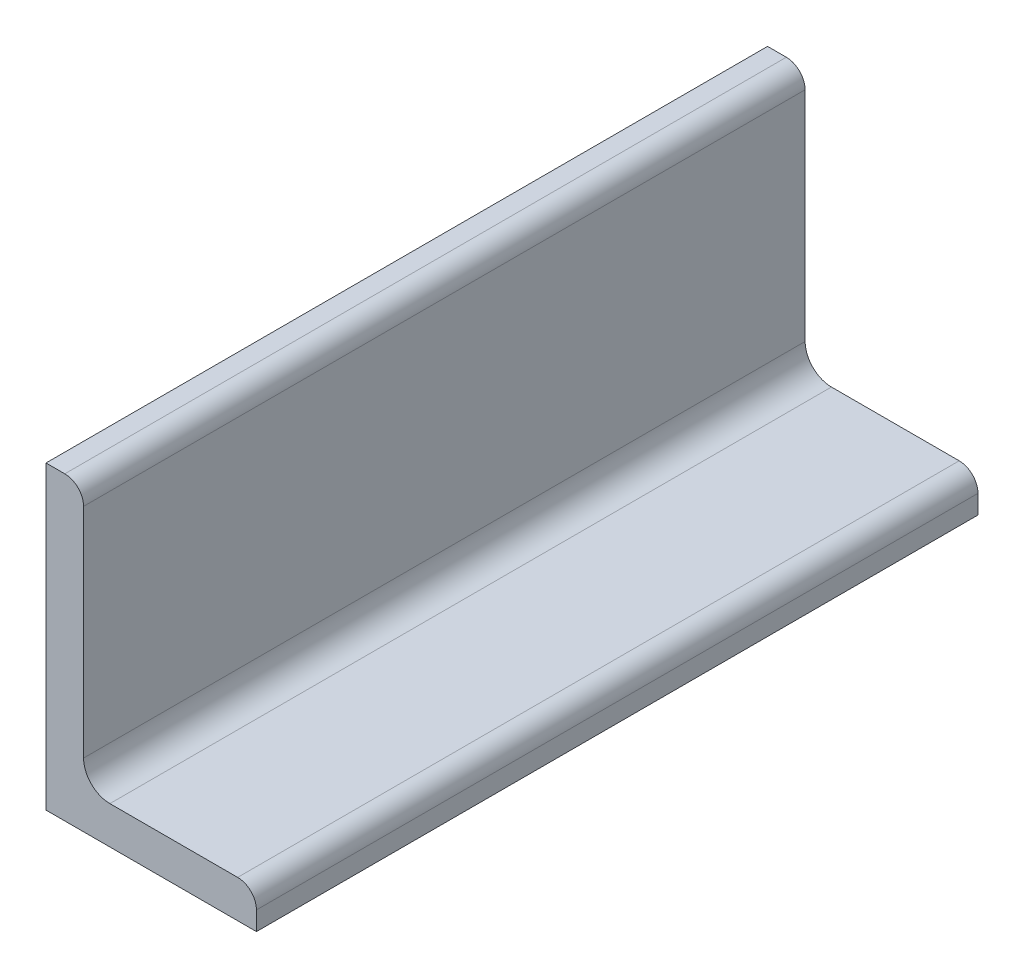
ISO-10303-21;
HEADER;
FILE_DESCRIPTION(('STEP AP214'),'2;1');
FILE_NAME('part.step','',(''),(''),'','','');
FILE_SCHEMA(('AUTOMOTIVE_DESIGN { 1 0 10303 214 1 1 1 1 }'));
ENDSEC;
DATA;
#1=APPLICATION_CONTEXT('core data for automotive mechanical design processes');
#2=APPLICATION_PROTOCOL_DEFINITION('international standard','automotive_design',2000,#1);
#3=PRODUCT_CONTEXT('',#1,'mechanical');
#4=PRODUCT('Part','Part','',(#3));
#5=PRODUCT_RELATED_PRODUCT_CATEGORY('part','',(#4));
#6=PRODUCT_DEFINITION_FORMATION('','',#4);
#7=PRODUCT_DEFINITION_CONTEXT('part definition',#1,'design');
#8=PRODUCT_DEFINITION('design','',#6,#7);
#9=PRODUCT_DEFINITION_SHAPE('','',#8);
#10=(LENGTH_UNIT() NAMED_UNIT(*) SI_UNIT(.MILLI.,.METRE.));
#11=(NAMED_UNIT(*) PLANE_ANGLE_UNIT() SI_UNIT($,.RADIAN.));
#12=(NAMED_UNIT(*) SI_UNIT($,.STERADIAN.) SOLID_ANGLE_UNIT());
#13=UNCERTAINTY_MEASURE_WITH_UNIT(LENGTH_MEASURE(1.E-05),#10,'distance_accuracy_value','');
#14=(GEOMETRIC_REPRESENTATION_CONTEXT(3) GLOBAL_UNCERTAINTY_ASSIGNED_CONTEXT((#13)) GLOBAL_UNIT_ASSIGNED_CONTEXT((#10,
#11,#12)) REPRESENTATION_CONTEXT('',''));
#15=CARTESIAN_POINT('',(0.,0.,0.));
#16=DIRECTION('',(0.,0.,1.));
#17=DIRECTION('',(1.,0.,0.));
#18=AXIS2_PLACEMENT_3D('',#15,#16,#17);
#19=CARTESIAN_POINT('',(0.0836264027816469,127.041655270204,304.8));
#20=DIRECTION('',(1.,0.,0.));
#21=DIRECTION('',(0.,0.,-1.));
#22=AXIS2_PLACEMENT_3D('',#19,#20,#21);
#23=PLANE('',#22);
#24=DIRECTION('',(0.,-1.,0.));
#25=VECTOR('',#24,1.);
#26=CARTESIAN_POINT('',(0.0836264027816469,127.041655270204,0.));
#27=LINE('',#26,#25);
#28=CARTESIAN_POINT('',(0.0836264027816469,127.041655270204,0.));
#29=VERTEX_POINT('',#28);
#30=CARTESIAN_POINT('',(0.0836264027816469,0.0416552702040917,0.));
#31=VERTEX_POINT('',#30);
#32=EDGE_CURVE('E135',#29,#31,#27,.T.);
#33=ORIENTED_EDGE('',*,*,#32,.T.);
#34=DIRECTION('',(0.,0.,-1.));
#35=VECTOR('',#34,1.);
#36=CARTESIAN_POINT('',(0.0836264027816469,0.0416552702040917,304.8));
#37=LINE('',#36,#35);
#38=CARTESIAN_POINT('',(0.0836264027816469,0.0416552702040917,304.8));
#39=VERTEX_POINT('',#38);
#40=EDGE_CURVE('E11',#39,#31,#37,.T.);
#41=ORIENTED_EDGE('',*,*,#40,.F.);
#42=DIRECTION('',(0.,-1.,0.));
#43=VECTOR('',#42,1.);
#44=CARTESIAN_POINT('',(0.0836264027816469,127.041655270204,304.8));
#45=LINE('',#44,#43);
#46=CARTESIAN_POINT('',(0.0836264027816469,127.041655270204,304.8));
#47=VERTEX_POINT('',#46);
#48=EDGE_CURVE('E151',#47,#39,#45,.T.);
#49=ORIENTED_EDGE('',*,*,#48,.F.);
#50=DIRECTION('',(0.,0.,-1.));
#51=VECTOR('',#50,1.);
#52=CARTESIAN_POINT('',(0.0836264027816469,127.041655270204,304.8));
#53=LINE('',#52,#51);
#54=EDGE_CURVE('E131',#47,#29,#53,.T.);
#55=ORIENTED_EDGE('',*,*,#54,.T.);
#56=EDGE_LOOP('',(#33,#41,#49,#55));
#57=FACE_BOUND('',#56,.T.);
#58=ADVANCED_FACE('F33',(#57),#23,.F.);
#59=CARTESIAN_POINT('',(0.0836264027816469,0.0416552702040917,304.8));
#60=DIRECTION('',(0.,1.,0.));
#61=DIRECTION('',(0.,0.,1.));
#62=AXIS2_PLACEMENT_3D('',#59,#60,#61);
#63=PLANE('',#62);
#64=DIRECTION('',(1.,0.,0.));
#65=VECTOR('',#64,1.);
#66=CARTESIAN_POINT('',(0.0836264027816469,0.0416552702040917,0.));
#67=LINE('',#66,#65);
#68=CARTESIAN_POINT('',(88.9836264027817,0.0416552702040917,0.));
#69=VERTEX_POINT('',#68);
#70=EDGE_CURVE('E138',#31,#69,#67,.T.);
#71=ORIENTED_EDGE('',*,*,#70,.T.);
#72=DIRECTION('',(0.,0.,-1.));
#73=VECTOR('',#72,1.);
#74=CARTESIAN_POINT('',(88.9836264027817,0.0416552702040917,304.8));
#75=LINE('',#74,#73);
#76=CARTESIAN_POINT('',(88.9836264027817,0.0416552702040917,304.8));
#77=VERTEX_POINT('',#76);
#78=EDGE_CURVE('E41',#77,#69,#75,.T.);
#79=ORIENTED_EDGE('',*,*,#78,.F.);
#80=DIRECTION('',(1.,0.,0.));
#81=VECTOR('',#80,1.);
#82=CARTESIAN_POINT('',(0.0836264027816469,0.0416552702040917,304.8));
#83=LINE('',#82,#81);
#84=EDGE_CURVE('E95',#39,#77,#83,.T.);
#85=ORIENTED_EDGE('',*,*,#84,.F.);
#86=ORIENTED_EDGE('',*,*,#40,.T.);
#87=EDGE_LOOP('',(#71,#79,#85,#86));
#88=FACE_BOUND('',#87,.T.);
#89=ADVANCED_FACE('F194',(#88),#63,.F.);
#90=CARTESIAN_POINT('',(88.9836264027817,0.0416552702040917,304.8));
#91=DIRECTION('',(-1.,0.,0.));
#92=DIRECTION('',(0.,0.,1.));
#93=AXIS2_PLACEMENT_3D('',#90,#91,#92);
#94=PLANE('',#93);
#95=DIRECTION('',(0.,1.,0.));
#96=VECTOR('',#95,1.);
#97=CARTESIAN_POINT('',(88.9836264027817,0.0416552702040917,0.));
#98=LINE('',#97,#96);
#99=CARTESIAN_POINT('',(88.9836264027817,7.97915527020409,0.));
#100=VERTEX_POINT('',#99);
#101=EDGE_CURVE('E140',#69,#100,#98,.T.);
#102=ORIENTED_EDGE('',*,*,#101,.T.);
#103=DIRECTION('',(0.,0.,-1.));
#104=VECTOR('',#103,1.);
#105=CARTESIAN_POINT('',(88.9836264027817,7.97915527020409,304.8));
#106=LINE('',#105,#104);
#107=CARTESIAN_POINT('',(88.9836264027817,7.97915527020409,304.8));
#108=VERTEX_POINT('',#107);
#109=EDGE_CURVE('E161',#108,#100,#106,.T.);
#110=ORIENTED_EDGE('',*,*,#109,.F.);
#111=DIRECTION('',(0.,1.,0.));
#112=VECTOR('',#111,1.);
#113=CARTESIAN_POINT('',(88.9836264027817,0.0416552702040917,304.8));
#114=LINE('',#113,#112);
#115=EDGE_CURVE('E169',#77,#108,#114,.T.);
#116=ORIENTED_EDGE('',*,*,#115,.F.);
#117=ORIENTED_EDGE('',*,*,#78,.T.);
#118=EDGE_LOOP('',(#102,#110,#116,#117));
#119=FACE_BOUND('',#118,.T.);
#120=ADVANCED_FACE('F167',(#119),#94,.F.);
#121=CARTESIAN_POINT('',(81.0461264027816,7.97915527020409,304.8));
#122=DIRECTION('',(0.,0.,-1.));
#123=DIRECTION('',(-1.,0.,0.));
#124=AXIS2_PLACEMENT_3D('',#121,#122,#123);
#125=CYLINDRICAL_SURFACE('',#124,7.93750000000001);
#126=CARTESIAN_POINT('',(81.0461264027816,7.97915527020409,0.));
#127=DIRECTION('',(0.,0.,1.));
#128=DIRECTION('',(1.,0.,0.));
#129=AXIS2_PLACEMENT_3D('',#126,#127,#128);
#130=CIRCLE('',#129,7.93750000000001);
#131=CARTESIAN_POINT('',(81.0461264027816,15.9166552702041,0.));
#132=VERTEX_POINT('',#131);
#133=EDGE_CURVE('E142',#100,#132,#130,.T.);
#134=ORIENTED_EDGE('',*,*,#133,.T.);
#135=DIRECTION('',(0.,0.,-1.));
#136=VECTOR('',#135,1.);
#137=CARTESIAN_POINT('',(81.0461264027816,15.9166552702041,304.8));
#138=LINE('',#137,#136);
#139=CARTESIAN_POINT('',(81.0461264027816,15.9166552702041,304.8));
#140=VERTEX_POINT('',#139);
#141=EDGE_CURVE('E158',#140,#132,#138,.T.);
#142=ORIENTED_EDGE('',*,*,#141,.F.);
#143=CARTESIAN_POINT('',(81.0461264027816,7.97915527020409,304.8));
#144=DIRECTION('',(0.,0.,1.));
#145=DIRECTION('',(1.,0.,0.));
#146=AXIS2_PLACEMENT_3D('',#143,#144,#145);
#147=CIRCLE('',#146,7.93750000000001);
#148=EDGE_CURVE('E185',#108,#140,#147,.T.);
#149=ORIENTED_EDGE('',*,*,#148,.F.);
#150=ORIENTED_EDGE('',*,*,#109,.T.);
#151=EDGE_LOOP('',(#134,#142,#149,#150));
#152=FACE_BOUND('',#151,.T.);
#153=ADVANCED_FACE('F178',(#152),#125,.T.);
#154=CARTESIAN_POINT('',(81.0461264027816,15.9166552702041,304.8));
#155=DIRECTION('',(0.,-1.,0.));
#156=DIRECTION('',(0.,0.,-1.));
#157=AXIS2_PLACEMENT_3D('',#154,#155,#156);
#158=PLANE('',#157);
#159=DIRECTION('',(-1.,0.,0.));
#160=VECTOR('',#159,1.);
#161=CARTESIAN_POINT('',(81.0461264027816,15.9166552702041,0.));
#162=LINE('',#161,#160);
#163=CARTESIAN_POINT('',(27.0711264027816,15.9166552702041,0.));
#164=VERTEX_POINT('',#163);
#165=EDGE_CURVE('E144',#132,#164,#162,.T.);
#166=ORIENTED_EDGE('',*,*,#165,.T.);
#167=DIRECTION('',(0.,0.,-1.));
#168=VECTOR('',#167,1.);
#169=CARTESIAN_POINT('',(27.0711264027816,15.9166552702041,304.8));
#170=LINE('',#169,#168);
#171=CARTESIAN_POINT('',(27.0711264027816,15.9166552702041,304.8));
#172=VERTEX_POINT('',#171);
#173=EDGE_CURVE('E155',#172,#164,#170,.T.);
#174=ORIENTED_EDGE('',*,*,#173,.F.);
#175=DIRECTION('',(-1.,0.,0.));
#176=VECTOR('',#175,1.);
#177=CARTESIAN_POINT('',(81.0461264027816,15.9166552702041,304.8));
#178=LINE('',#177,#176);
#179=EDGE_CURVE('E184',#140,#172,#178,.T.);
#180=ORIENTED_EDGE('',*,*,#179,.F.);
#181=ORIENTED_EDGE('',*,*,#141,.T.);
#182=EDGE_LOOP('',(#166,#174,#180,#181));
#183=FACE_BOUND('',#182,.T.);
#184=ADVANCED_FACE('F182',(#183),#158,.F.);
#185=CARTESIAN_POINT('',(27.0711264027816,27.0291552702041,304.8));
#186=DIRECTION('',(0.,0.,-1.));
#187=DIRECTION('',(-1.,0.,0.));
#188=AXIS2_PLACEMENT_3D('',#185,#186,#187);
#189=CYLINDRICAL_SURFACE('',#188,11.1125);
#190=CARTESIAN_POINT('',(27.0711264027816,27.0291552702041,0.));
#191=DIRECTION('',(0.,0.,-1.));
#192=DIRECTION('',(1.,0.,0.));
#193=AXIS2_PLACEMENT_3D('',#190,#191,#192);
#194=CIRCLE('',#193,11.1125);
#195=CARTESIAN_POINT('',(15.9586264027816,27.0291552702041,0.));
#196=VERTEX_POINT('',#195);
#197=EDGE_CURVE('E146',#164,#196,#194,.T.);
#198=ORIENTED_EDGE('',*,*,#197,.T.);
#199=DIRECTION('',(0.,0.,-1.));
#200=VECTOR('',#199,1.);
#201=CARTESIAN_POINT('',(15.9586264027816,27.0291552702041,304.8));
#202=LINE('',#201,#200);
#203=CARTESIAN_POINT('',(15.9586264027816,27.0291552702041,304.8));
#204=VERTEX_POINT('',#203);
#205=EDGE_CURVE('E126',#204,#196,#202,.T.);
#206=ORIENTED_EDGE('',*,*,#205,.F.);
#207=CARTESIAN_POINT('',(27.0711264027816,27.0291552702041,304.8));
#208=DIRECTION('',(0.,0.,-1.));
#209=DIRECTION('',(1.,0.,0.));
#210=AXIS2_PLACEMENT_3D('',#207,#208,#209);
#211=CIRCLE('',#210,11.1125);
#212=EDGE_CURVE('E117',#172,#204,#211,.T.);
#213=ORIENTED_EDGE('',*,*,#212,.F.);
#214=ORIENTED_EDGE('',*,*,#173,.T.);
#215=EDGE_LOOP('',(#198,#206,#213,#214));
#216=FACE_BOUND('',#215,.T.);
#217=ADVANCED_FACE('F206',(#216),#189,.F.);
#218=CARTESIAN_POINT('',(15.9586264027816,27.0291552702041,304.8));
#219=DIRECTION('',(-1.,0.,0.));
#220=DIRECTION('',(0.,0.,1.));
#221=AXIS2_PLACEMENT_3D('',#218,#219,#220);
#222=PLANE('',#221);
#223=DIRECTION('',(0.,1.,0.));
#224=VECTOR('',#223,1.);
#225=CARTESIAN_POINT('',(15.9586264027816,27.0291552702041,0.));
#226=LINE('',#225,#224);
#227=CARTESIAN_POINT('',(15.9586264027816,119.104155270204,0.));
#228=VERTEX_POINT('',#227);
#229=EDGE_CURVE('E125',#196,#228,#226,.T.);
#230=ORIENTED_EDGE('',*,*,#229,.T.);
#231=DIRECTION('',(0.,0.,-1.));
#232=VECTOR('',#231,1.);
#233=CARTESIAN_POINT('',(15.9586264027816,119.104155270204,304.8));
#234=LINE('',#233,#232);
#235=CARTESIAN_POINT('',(15.9586264027816,119.104155270204,304.8));
#236=VERTEX_POINT('',#235);
#237=EDGE_CURVE('E122',#236,#228,#234,.T.);
#238=ORIENTED_EDGE('',*,*,#237,.F.);
#239=DIRECTION('',(0.,1.,0.));
#240=VECTOR('',#239,1.);
#241=CARTESIAN_POINT('',(15.9586264027816,27.0291552702041,304.8));
#242=LINE('',#241,#240);
#243=EDGE_CURVE('E111',#204,#236,#242,.T.);
#244=ORIENTED_EDGE('',*,*,#243,.F.);
#245=ORIENTED_EDGE('',*,*,#205,.T.);
#246=EDGE_LOOP('',(#230,#238,#244,#245));
#247=FACE_BOUND('',#246,.T.);
#248=ADVANCED_FACE('F123',(#247),#222,.F.);
#249=CARTESIAN_POINT('',(8.02112640278165,119.104155270204,304.8));
#250=DIRECTION('',(0.,0.,-1.));
#251=DIRECTION('',(-1.,0.,0.));
#252=AXIS2_PLACEMENT_3D('',#249,#250,#251);
#253=CYLINDRICAL_SURFACE('',#252,7.9375);
#254=CARTESIAN_POINT('',(8.02112640278165,119.104155270204,0.));
#255=DIRECTION('',(0.,0.,1.));
#256=DIRECTION('',(1.,0.,0.));
#257=AXIS2_PLACEMENT_3D('',#254,#255,#256);
#258=CIRCLE('',#257,7.9375);
#259=CARTESIAN_POINT('',(8.02112640278165,127.041655270204,0.));
#260=VERTEX_POINT('',#259);
#261=EDGE_CURVE('E81',#228,#260,#258,.T.);
#262=ORIENTED_EDGE('',*,*,#261,.T.);
#263=DIRECTION('',(0.,0.,-1.));
#264=VECTOR('',#263,1.);
#265=CARTESIAN_POINT('',(8.02112640278165,127.041655270204,304.8));
#266=LINE('',#265,#264);
#267=CARTESIAN_POINT('',(8.02112640278165,127.041655270204,304.8));
#268=VERTEX_POINT('',#267);
#269=EDGE_CURVE('E127',#268,#260,#266,.T.);
#270=ORIENTED_EDGE('',*,*,#269,.F.);
#271=CARTESIAN_POINT('',(8.02112640278165,119.104155270204,304.8));
#272=DIRECTION('',(0.,0.,1.));
#273=DIRECTION('',(1.,0.,0.));
#274=AXIS2_PLACEMENT_3D('',#271,#272,#273);
#275=CIRCLE('',#274,7.9375);
#276=EDGE_CURVE('E115',#236,#268,#275,.T.);
#277=ORIENTED_EDGE('',*,*,#276,.F.);
#278=ORIENTED_EDGE('',*,*,#237,.T.);
#279=EDGE_LOOP('',(#262,#270,#277,#278));
#280=FACE_BOUND('',#279,.T.);
#281=ADVANCED_FACE('F129',(#280),#253,.T.);
#282=CARTESIAN_POINT('',(8.02112640278165,127.041655270204,304.8));
#283=DIRECTION('',(0.,-1.,0.));
#284=DIRECTION('',(0.,0.,-1.));
#285=AXIS2_PLACEMENT_3D('',#282,#283,#284);
#286=PLANE('',#285);
#287=DIRECTION('',(-1.,0.,0.));
#288=VECTOR('',#287,1.);
#289=CARTESIAN_POINT('',(8.02112640278165,127.041655270204,0.));
#290=LINE('',#289,#288);
#291=EDGE_CURVE('E87',#260,#29,#290,.T.);
#292=ORIENTED_EDGE('',*,*,#291,.T.);
#293=ORIENTED_EDGE('',*,*,#54,.F.);
#294=DIRECTION('',(-1.,0.,0.));
#295=VECTOR('',#294,1.);
#296=CARTESIAN_POINT('',(8.02112640278165,127.041655270204,304.8));
#297=LINE('',#296,#295);
#298=EDGE_CURVE('E49',#268,#47,#297,.T.);
#299=ORIENTED_EDGE('',*,*,#298,.F.);
#300=ORIENTED_EDGE('',*,*,#269,.T.);
#301=EDGE_LOOP('',(#292,#293,#299,#300));
#302=FACE_BOUND('',#301,.T.);
#303=ADVANCED_FACE('F214',(#302),#286,.F.);
#304=CARTESIAN_POINT('',(81.0461264027816,7.97915527020409,304.8));
#305=DIRECTION('',(0.,0.,1.));
#306=DIRECTION('',(1.,0.,0.));
#307=AXIS2_PLACEMENT_3D('',#304,#305,#306);
#308=PLANE('',#307);
#309=ORIENTED_EDGE('',*,*,#48,.T.);
#310=ORIENTED_EDGE('',*,*,#84,.T.);
#311=ORIENTED_EDGE('',*,*,#115,.T.);
#312=ORIENTED_EDGE('',*,*,#148,.T.);
#313=ORIENTED_EDGE('',*,*,#179,.T.);
#314=ORIENTED_EDGE('',*,*,#212,.T.);
#315=ORIENTED_EDGE('',*,*,#243,.T.);
#316=ORIENTED_EDGE('',*,*,#276,.T.);
#317=ORIENTED_EDGE('',*,*,#298,.T.);
#318=EDGE_LOOP('',(#309,#310,#311,#312,#313,#314,#315,#316,#317));
#319=FACE_BOUND('',#318,.T.);
#320=ADVANCED_FACE('F113',(#319),#308,.T.);
#321=CARTESIAN_POINT('',(81.0461264027816,7.97915527020409,0.));
#322=DIRECTION('',(0.,0.,1.));
#323=DIRECTION('',(1.,0.,0.));
#324=AXIS2_PLACEMENT_3D('',#321,#322,#323);
#325=PLANE('',#324);
#326=ORIENTED_EDGE('',*,*,#32,.F.);
#327=ORIENTED_EDGE('',*,*,#291,.F.);
#328=ORIENTED_EDGE('',*,*,#261,.F.);
#329=ORIENTED_EDGE('',*,*,#229,.F.);
#330=ORIENTED_EDGE('',*,*,#197,.F.);
#331=ORIENTED_EDGE('',*,*,#165,.F.);
#332=ORIENTED_EDGE('',*,*,#133,.F.);
#333=ORIENTED_EDGE('',*,*,#101,.F.);
#334=ORIENTED_EDGE('',*,*,#70,.F.);
#335=EDGE_LOOP('',(#326,#327,#328,#329,#330,#331,#332,#333,#334));
#336=FACE_BOUND('',#335,.T.);
#337=ADVANCED_FACE('F173',(#336),#325,.F.);
#338=CLOSED_SHELL('',(#58,#89,#120,#153,#184,#217,#248,#281,#303,#320,#337));
#339=MANIFOLD_SOLID_BREP('B2',#338);
#340=ADVANCED_BREP_SHAPE_REPRESENTATION('',(#18,#339),#14);
#341=SHAPE_DEFINITION_REPRESENTATION(#9,#340);
ENDSEC;
END-ISO-10303-21;
